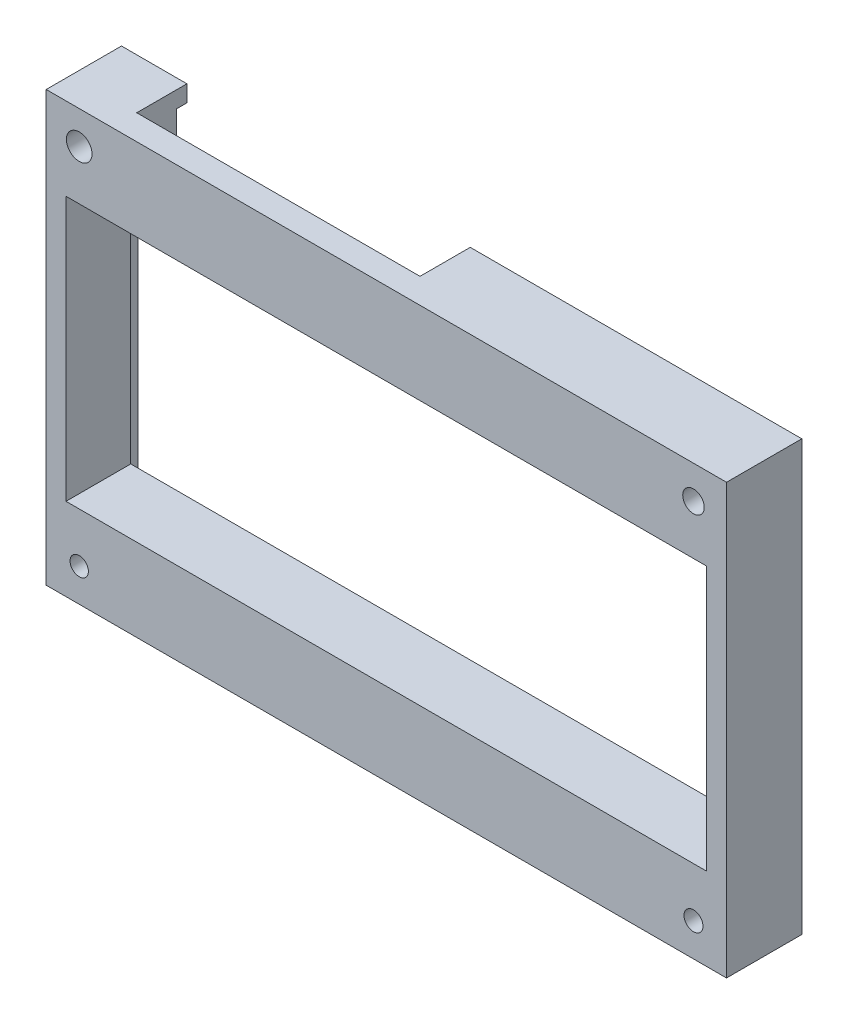
ISO-10303-21;
HEADER;
FILE_DESCRIPTION(('STEP AP214'),'2;1');
FILE_NAME('part.step','',(''),(''),'','','');
FILE_SCHEMA(('AUTOMOTIVE_DESIGN { 1 0 10303 214 1 1 1 1 }'));
ENDSEC;
DATA;
#1=APPLICATION_CONTEXT('core data for automotive mechanical design processes');
#2=APPLICATION_PROTOCOL_DEFINITION('international standard','automotive_design',2000,#1);
#3=PRODUCT_CONTEXT('',#1,'mechanical');
#4=PRODUCT('Part','Part','',(#3));
#5=PRODUCT_RELATED_PRODUCT_CATEGORY('part','',(#4));
#6=PRODUCT_DEFINITION_FORMATION('','',#4);
#7=PRODUCT_DEFINITION_CONTEXT('part definition',#1,'design');
#8=PRODUCT_DEFINITION('design','',#6,#7);
#9=PRODUCT_DEFINITION_SHAPE('','',#8);
#10=(LENGTH_UNIT() NAMED_UNIT(*) SI_UNIT(.MILLI.,.METRE.));
#11=(NAMED_UNIT(*) PLANE_ANGLE_UNIT() SI_UNIT($,.RADIAN.));
#12=(NAMED_UNIT(*) SI_UNIT($,.STERADIAN.) SOLID_ANGLE_UNIT());
#13=UNCERTAINTY_MEASURE_WITH_UNIT(LENGTH_MEASURE(1.E-05),#10,'distance_accuracy_value','');
#14=(GEOMETRIC_REPRESENTATION_CONTEXT(3) GLOBAL_UNCERTAINTY_ASSIGNED_CONTEXT((#13)) GLOBAL_UNIT_ASSIGNED_CONTEXT((#10,
#11,#12)) REPRESENTATION_CONTEXT('',''));
#15=CARTESIAN_POINT('',(0.,0.,0.));
#16=DIRECTION('',(0.,0.,1.));
#17=DIRECTION('',(1.,0.,0.));
#18=AXIS2_PLACEMENT_3D('',#15,#16,#17);
#19=CARTESIAN_POINT('',(-49.,30.0000000000002,-1.6));
#20=DIRECTION('',(0.,-1.,0.));
#21=DIRECTION('',(0.,0.,-1.));
#22=AXIS2_PLACEMENT_3D('',#19,#20,#21);
#23=PLANE('',#22);
#24=DIRECTION('',(0.,0.,1.));
#25=VECTOR('',#24,1.);
#26=CARTESIAN_POINT('',(1.29689939311386,30.0000000000002,-1.6));
#27=LINE('',#26,#25);
#28=CARTESIAN_POINT('',(1.29689939311386,30.0000000000002,-1.6));
#29=VERTEX_POINT('',#28);
#30=CARTESIAN_POINT('',(1.29689939311386,30.0000000000002,0.));
#31=VERTEX_POINT('',#30);
#32=EDGE_CURVE('E11',#29,#31,#27,.T.);
#33=ORIENTED_EDGE('',*,*,#32,.F.);
#34=DIRECTION('',(1.,0.,0.));
#35=VECTOR('',#34,1.);
#36=CARTESIAN_POINT('',(-49.,30.0000000000002,-1.6));
#37=LINE('',#36,#35);
#38=CARTESIAN_POINT('',(49.0000000000001,30.0000000000002,-1.6));
#39=VERTEX_POINT('',#38);
#40=EDGE_CURVE('E281',#29,#39,#37,.T.);
#41=ORIENTED_EDGE('',*,*,#40,.T.);
#42=DIRECTION('',(0.,0.,1.));
#43=VECTOR('',#42,1.);
#44=CARTESIAN_POINT('',(49.0000000000001,30.0000000000002,-1.6));
#45=LINE('',#44,#43);
#46=CARTESIAN_POINT('',(49.0000000000001,30.0000000000002,0.));
#47=VERTEX_POINT('',#46);
#48=EDGE_CURVE('E173',#39,#47,#45,.T.);
#49=ORIENTED_EDGE('',*,*,#48,.T.);
#50=DIRECTION('',(1.,0.,0.));
#51=VECTOR('',#50,1.);
#52=CARTESIAN_POINT('',(-49.,30.0000000000002,0.));
#53=LINE('',#52,#51);
#54=EDGE_CURVE('E171',#31,#47,#53,.T.);
#55=ORIENTED_EDGE('',*,*,#54,.F.);
#56=EDGE_LOOP('',(#33,#41,#49,#55));
#57=FACE_BOUND('',#56,.T.);
#58=ADVANCED_FACE('F39',(#57),#23,.T.);
#59=CARTESIAN_POINT('',(0.,0.,0.));
#60=DIRECTION('',(0.,0.,-1.));
#61=DIRECTION('',(-1.,0.,0.));
#62=AXIS2_PLACEMENT_3D('',#59,#60,#61);
#63=PLANE('',#62);
#64=CARTESIAN_POINT('',(-46.5,-27.5,0.));
#65=DIRECTION('',(0.,0.,-1.));
#66=DIRECTION('',(-1.,0.,0.));
#67=AXIS2_PLACEMENT_3D('',#64,#65,#66);
#68=CIRCLE('',#67,1.38839076776673);
#69=CARTESIAN_POINT('',(-47.8883907677667,-27.5,0.));
#70=VERTEX_POINT('',#69);
#71=EDGE_CURVE('E271',#70,#70,#68,.T.);
#72=ORIENTED_EDGE('',*,*,#71,.F.);
#73=EDGE_LOOP('',(#72));
#74=FACE_BOUND('',#73,.T.);
#75=CARTESIAN_POINT('',(46.5,-27.5,0.));
#76=DIRECTION('',(0.,0.,-1.));
#77=DIRECTION('',(-1.,0.,0.));
#78=AXIS2_PLACEMENT_3D('',#75,#76,#77);
#79=CIRCLE('',#78,1.43808952105127);
#80=CARTESIAN_POINT('',(45.0619104789487,-27.5,0.));
#81=VERTEX_POINT('',#80);
#82=EDGE_CURVE('E260',#81,#81,#79,.T.);
#83=ORIENTED_EDGE('',*,*,#82,.F.);
#84=EDGE_LOOP('',(#83));
#85=FACE_BOUND('',#84,.T.);
#86=CARTESIAN_POINT('',(46.5,27.5,0.));
#87=DIRECTION('',(0.,0.,-1.));
#88=DIRECTION('',(-1.,0.,0.));
#89=AXIS2_PLACEMENT_3D('',#86,#87,#88);
#90=CIRCLE('',#89,1.6299701351415);
#91=CARTESIAN_POINT('',(44.8700298648585,27.5,0.));
#92=VERTEX_POINT('',#91);
#93=EDGE_CURVE('E257',#92,#92,#90,.T.);
#94=ORIENTED_EDGE('',*,*,#93,.F.);
#95=EDGE_LOOP('',(#94));
#96=FACE_BOUND('',#95,.T.);
#97=CARTESIAN_POINT('',(-46.5,27.5,0.));
#98=DIRECTION('',(0.,0.,-1.));
#99=DIRECTION('',(-1.,0.,0.));
#100=AXIS2_PLACEMENT_3D('',#97,#98,#99);
#101=CIRCLE('',#100,1.93858012139443);
#102=CARTESIAN_POINT('',(-48.4385801213944,27.5,0.));
#103=VERTEX_POINT('',#102);
#104=EDGE_CURVE('E254',#103,#103,#101,.T.);
#105=ORIENTED_EDGE('',*,*,#104,.F.);
#106=EDGE_LOOP('',(#105));
#107=FACE_BOUND('',#106,.T.);
#108=DIRECTION('',(0.,1.,0.));
#109=VECTOR('',#108,1.);
#110=CARTESIAN_POINT('',(-48.5,0.,0.));
#111=LINE('',#110,#109);
#112=CARTESIAN_POINT('',(-48.5,-20.,0.));
#113=VERTEX_POINT('',#112);
#114=CARTESIAN_POINT('',(-48.5,20.,0.));
#115=VERTEX_POINT('',#114);
#116=EDGE_CURVE('E177',#113,#115,#111,.T.);
#117=ORIENTED_EDGE('',*,*,#116,.F.);
#118=DIRECTION('',(-1.,0.,0.));
#119=VECTOR('',#118,1.);
#120=CARTESIAN_POINT('',(0.,-20.,0.));
#121=LINE('',#120,#119);
#122=CARTESIAN_POINT('',(48.5,-20.,0.));
#123=VERTEX_POINT('',#122);
#124=EDGE_CURVE('E242',#123,#113,#121,.T.);
#125=ORIENTED_EDGE('',*,*,#124,.F.);
#126=DIRECTION('',(0.,-1.,0.));
#127=VECTOR('',#126,1.);
#128=CARTESIAN_POINT('',(48.5,0.,0.));
#129=LINE('',#128,#127);
#130=CARTESIAN_POINT('',(48.5,20.,0.));
#131=VERTEX_POINT('',#130);
#132=EDGE_CURVE('E244',#131,#123,#129,.T.);
#133=ORIENTED_EDGE('',*,*,#132,.F.);
#134=DIRECTION('',(1.,0.,0.));
#135=VECTOR('',#134,1.);
#136=CARTESIAN_POINT('',(0.,20.,0.));
#137=LINE('',#136,#135);
#138=EDGE_CURVE('E247',#115,#131,#137,.T.);
#139=ORIENTED_EDGE('',*,*,#138,.F.);
#140=EDGE_LOOP('',(#117,#125,#133,#139));
#141=FACE_BOUND('',#140,.T.);
#142=DIRECTION('',(0.,1.,0.));
#143=VECTOR('',#142,1.);
#144=CARTESIAN_POINT('',(-49.,-29.9999999999997,0.));
#145=LINE('',#144,#143);
#146=CARTESIAN_POINT('',(-49.,-29.9999999999997,0.));
#147=VERTEX_POINT('',#146);
#148=CARTESIAN_POINT('',(-49.,30.0000000000002,0.));
#149=VERTEX_POINT('',#148);
#150=EDGE_CURVE('E278',#147,#149,#145,.T.);
#151=ORIENTED_EDGE('',*,*,#150,.T.);
#152=CARTESIAN_POINT('',(-41.5934162505298,30.0000000000002,0.));
#153=VERTEX_POINT('',#152);
#154=EDGE_CURVE('E179',#149,#153,#53,.T.);
#155=ORIENTED_EDGE('',*,*,#154,.T.);
#156=DIRECTION('',(0.,1.,0.));
#157=VECTOR('',#156,1.);
#158=CARTESIAN_POINT('',(-41.5934162505298,32.4999999999999,0.));
#159=LINE('',#158,#157);
#160=CARTESIAN_POINT('',(-41.5934162505298,22.5567983730593,0.));
#161=VERTEX_POINT('',#160);
#162=EDGE_CURVE('E186',#161,#153,#159,.T.);
#163=ORIENTED_EDGE('',*,*,#162,.F.);
#164=DIRECTION('',(-1.,0.,0.));
#165=VECTOR('',#164,1.);
#166=CARTESIAN_POINT('',(-41.5934162505298,22.5567983730593,0.));
#167=LINE('',#166,#165);
#168=CARTESIAN_POINT('',(1.29689939311384,22.5567983730593,0.));
#169=VERTEX_POINT('',#168);
#170=EDGE_CURVE('E185',#169,#161,#167,.T.);
#171=ORIENTED_EDGE('',*,*,#170,.F.);
#172=DIRECTION('',(0.,-1.,0.));
#173=VECTOR('',#172,1.);
#174=CARTESIAN_POINT('',(1.29689939311384,32.4999999999999,0.));
#175=LINE('',#174,#173);
#176=EDGE_CURVE('E166',#31,#169,#175,.T.);
#177=ORIENTED_EDGE('',*,*,#176,.F.);
#178=ORIENTED_EDGE('',*,*,#54,.T.);
#179=DIRECTION('',(0.,-1.,0.));
#180=VECTOR('',#179,1.);
#181=CARTESIAN_POINT('',(49.0000000000001,-29.9999999999997,0.));
#182=LINE('',#181,#180);
#183=CARTESIAN_POINT('',(49.0000000000001,-29.9999999999997,0.));
#184=VERTEX_POINT('',#183);
#185=EDGE_CURVE('E293',#47,#184,#182,.T.);
#186=ORIENTED_EDGE('',*,*,#185,.T.);
#187=DIRECTION('',(-1.,0.,0.));
#188=VECTOR('',#187,1.);
#189=CARTESIAN_POINT('',(-49.,-29.9999999999997,0.));
#190=LINE('',#189,#188);
#191=EDGE_CURVE('E282',#184,#147,#190,.T.);
#192=ORIENTED_EDGE('',*,*,#191,.T.);
#193=EDGE_LOOP('',(#151,#155,#163,#171,#177,#178,#186,#192));
#194=FACE_BOUND('',#193,.T.);
#195=ADVANCED_FACE('F182',(#74,#85,#96,#107,#141,#194),#63,.T.);
#196=CARTESIAN_POINT('',(-51.5,32.4999999999999,9.8));
#197=DIRECTION('',(1.,0.,0.));
#198=DIRECTION('',(0.,1.,0.));
#199=AXIS2_PLACEMENT_3D('',#196,#197,#198);
#200=PLANE('',#199);
#201=DIRECTION('',(0.,0.,-1.));
#202=VECTOR('',#201,1.);
#203=CARTESIAN_POINT('',(-51.5,32.4999999999999,9.8));
#204=LINE('',#203,#202);
#205=CARTESIAN_POINT('',(-51.5,32.4999999999999,9.8));
#206=VERTEX_POINT('',#205);
#207=CARTESIAN_POINT('',(-51.5,32.4999999999999,-1.6));
#208=VERTEX_POINT('',#207);
#209=EDGE_CURVE('E233',#206,#208,#204,.T.);
#210=ORIENTED_EDGE('',*,*,#209,.T.);
#211=DIRECTION('',(0.,1.,0.));
#212=VECTOR('',#211,1.);
#213=CARTESIAN_POINT('',(-51.5,-32.5000000000001,-1.6));
#214=LINE('',#213,#212);
#215=CARTESIAN_POINT('',(-51.5,-32.5000000000001,-1.6));
#216=VERTEX_POINT('',#215);
#217=EDGE_CURVE('E304',#216,#208,#214,.T.);
#218=ORIENTED_EDGE('',*,*,#217,.F.);
#219=DIRECTION('',(0.,0.,-1.));
#220=VECTOR('',#219,1.);
#221=CARTESIAN_POINT('',(-51.5,-32.5000000000001,9.8));
#222=LINE('',#221,#220);
#223=CARTESIAN_POINT('',(-51.5,-32.5000000000001,9.8));
#224=VERTEX_POINT('',#223);
#225=EDGE_CURVE('E240',#224,#216,#222,.T.);
#226=ORIENTED_EDGE('',*,*,#225,.F.);
#227=DIRECTION('',(0.,-1.,0.));
#228=VECTOR('',#227,1.);
#229=CARTESIAN_POINT('',(-51.5,32.4999999999999,9.8));
#230=LINE('',#229,#228);
#231=EDGE_CURVE('E218',#206,#224,#230,.T.);
#232=ORIENTED_EDGE('',*,*,#231,.F.);
#233=EDGE_LOOP('',(#210,#218,#226,#232));
#234=FACE_BOUND('',#233,.T.);
#235=ADVANCED_FACE('F41',(#234),#200,.F.);
#236=CARTESIAN_POINT('',(51.5,-32.5,9.8));
#237=DIRECTION('',(0.,1.,0.));
#238=DIRECTION('',(-1.,0.,0.));
#239=AXIS2_PLACEMENT_3D('',#236,#237,#238);
#240=PLANE('',#239);
#241=ORIENTED_EDGE('',*,*,#225,.T.);
#242=DIRECTION('',(-1.,0.,0.));
#243=VECTOR('',#242,1.);
#244=CARTESIAN_POINT('',(-51.5,-32.5000000000001,-1.6));
#245=LINE('',#244,#243);
#246=CARTESIAN_POINT('',(51.5,-32.5000000000001,-1.6));
#247=VERTEX_POINT('',#246);
#248=EDGE_CURVE('E191',#247,#216,#245,.T.);
#249=ORIENTED_EDGE('',*,*,#248,.F.);
#250=DIRECTION('',(0.,0.,-1.));
#251=VECTOR('',#250,1.);
#252=CARTESIAN_POINT('',(51.5,-32.5,9.8));
#253=LINE('',#252,#251);
#254=CARTESIAN_POINT('',(51.5,-32.5,9.8));
#255=VERTEX_POINT('',#254);
#256=EDGE_CURVE('E238',#255,#247,#253,.T.);
#257=ORIENTED_EDGE('',*,*,#256,.F.);
#258=DIRECTION('',(1.,0.,0.));
#259=VECTOR('',#258,1.);
#260=CARTESIAN_POINT('',(51.5,-32.5,9.8));
#261=LINE('',#260,#259);
#262=EDGE_CURVE('E227',#224,#255,#261,.T.);
#263=ORIENTED_EDGE('',*,*,#262,.F.);
#264=EDGE_LOOP('',(#241,#249,#257,#263));
#265=FACE_BOUND('',#264,.T.);
#266=ADVANCED_FACE('F375',(#265),#240,.F.);
#267=CARTESIAN_POINT('',(51.5,32.4999999999999,9.8));
#268=DIRECTION('',(-1.,0.,0.));
#269=DIRECTION('',(0.,-1.,0.));
#270=AXIS2_PLACEMENT_3D('',#267,#268,#269);
#271=PLANE('',#270);
#272=ORIENTED_EDGE('',*,*,#256,.T.);
#273=DIRECTION('',(0.,-1.,0.));
#274=VECTOR('',#273,1.);
#275=CARTESIAN_POINT('',(51.5,-32.5000000000001,-1.6));
#276=LINE('',#275,#274);
#277=CARTESIAN_POINT('',(51.5,32.4999999999999,-1.6));
#278=VERTEX_POINT('',#277);
#279=EDGE_CURVE('E311',#278,#247,#276,.T.);
#280=ORIENTED_EDGE('',*,*,#279,.F.);
#281=DIRECTION('',(0.,0.,-1.));
#282=VECTOR('',#281,1.);
#283=CARTESIAN_POINT('',(51.5,32.4999999999999,9.8));
#284=LINE('',#283,#282);
#285=CARTESIAN_POINT('',(51.5,32.4999999999999,9.8));
#286=VERTEX_POINT('',#285);
#287=EDGE_CURVE('E235',#286,#278,#284,.T.);
#288=ORIENTED_EDGE('',*,*,#287,.F.);
#289=DIRECTION('',(0.,1.,0.));
#290=VECTOR('',#289,1.);
#291=CARTESIAN_POINT('',(51.5,32.4999999999999,9.8));
#292=LINE('',#291,#290);
#293=EDGE_CURVE('E229',#255,#286,#292,.T.);
#294=ORIENTED_EDGE('',*,*,#293,.F.);
#295=EDGE_LOOP('',(#272,#280,#288,#294));
#296=FACE_BOUND('',#295,.T.);
#297=ADVANCED_FACE('F384',(#296),#271,.F.);
#298=CARTESIAN_POINT('',(51.5,32.4999999999999,9.8));
#299=DIRECTION('',(0.,-1.,0.));
#300=DIRECTION('',(1.,0.,0.));
#301=AXIS2_PLACEMENT_3D('',#298,#299,#300);
#302=PLANE('',#301);
#303=DIRECTION('',(1.,0.,0.));
#304=VECTOR('',#303,1.);
#305=CARTESIAN_POINT('',(-51.5,32.4999999999999,-1.6));
#306=LINE('',#305,#304);
#307=CARTESIAN_POINT('',(1.29689939311385,32.4999999999999,-1.6));
#308=VERTEX_POINT('',#307);
#309=EDGE_CURVE('E307',#308,#278,#306,.T.);
#310=ORIENTED_EDGE('',*,*,#309,.F.);
#311=DIRECTION('',(0.,0.,-1.));
#312=VECTOR('',#311,1.);
#313=CARTESIAN_POINT('',(1.29689939311384,32.4999999999999,6.));
#314=LINE('',#313,#312);
#315=CARTESIAN_POINT('',(1.29689939311384,32.4999999999999,6.));
#316=VERTEX_POINT('',#315);
#317=EDGE_CURVE('E200',#316,#308,#314,.T.);
#318=ORIENTED_EDGE('',*,*,#317,.F.);
#319=DIRECTION('',(1.,0.,0.));
#320=VECTOR('',#319,1.);
#321=CARTESIAN_POINT('',(-41.5934162505298,32.4999999999999,6.));
#322=LINE('',#321,#320);
#323=CARTESIAN_POINT('',(-41.5934162505298,32.4999999999999,6.));
#324=VERTEX_POINT('',#323);
#325=EDGE_CURVE('E318',#324,#316,#322,.T.);
#326=ORIENTED_EDGE('',*,*,#325,.F.);
#327=DIRECTION('',(0.,0.,-1.));
#328=VECTOR('',#327,1.);
#329=CARTESIAN_POINT('',(-41.5934162505298,32.4999999999999,6.));
#330=LINE('',#329,#328);
#331=CARTESIAN_POINT('',(-41.5934162505298,32.4999999999999,-1.6));
#332=VERTEX_POINT('',#331);
#333=EDGE_CURVE('E202',#324,#332,#330,.T.);
#334=ORIENTED_EDGE('',*,*,#333,.T.);
#335=EDGE_CURVE('E308',#208,#332,#306,.T.);
#336=ORIENTED_EDGE('',*,*,#335,.F.);
#337=ORIENTED_EDGE('',*,*,#209,.F.);
#338=DIRECTION('',(-1.,0.,0.));
#339=VECTOR('',#338,1.);
#340=CARTESIAN_POINT('',(51.5,32.4999999999999,9.8));
#341=LINE('',#340,#339);
#342=EDGE_CURVE('E231',#286,#206,#341,.T.);
#343=ORIENTED_EDGE('',*,*,#342,.F.);
#344=ORIENTED_EDGE('',*,*,#287,.T.);
#345=EDGE_LOOP('',(#310,#318,#326,#334,#336,#337,#343,#344));
#346=FACE_BOUND('',#345,.T.);
#347=ADVANCED_FACE('F337',(#346),#302,.F.);
#348=CARTESIAN_POINT('',(0.,0.,9.8));
#349=DIRECTION('',(0.,0.,-1.));
#350=DIRECTION('',(-1.,0.,0.));
#351=AXIS2_PLACEMENT_3D('',#348,#349,#350);
#352=PLANE('',#351);
#353=CARTESIAN_POINT('',(-46.5,-27.5,9.8));
#354=DIRECTION('',(0.,0.,-1.));
#355=DIRECTION('',(-1.,0.,0.));
#356=AXIS2_PLACEMENT_3D('',#353,#354,#355);
#357=CIRCLE('',#356,1.38839076776673);
#358=CARTESIAN_POINT('',(-47.8883907677667,-27.5,9.8));
#359=VERTEX_POINT('',#358);
#360=EDGE_CURVE('E43',#359,#359,#357,.T.);
#361=ORIENTED_EDGE('',*,*,#360,.T.);
#362=EDGE_LOOP('',(#361));
#363=FACE_BOUND('',#362,.T.);
#364=CARTESIAN_POINT('',(46.5,-27.5,9.8));
#365=DIRECTION('',(0.,0.,-1.));
#366=DIRECTION('',(-1.,0.,0.));
#367=AXIS2_PLACEMENT_3D('',#364,#365,#366);
#368=CIRCLE('',#367,1.43808952105127);
#369=CARTESIAN_POINT('',(45.0619104789487,-27.5,9.8));
#370=VERTEX_POINT('',#369);
#371=EDGE_CURVE('E258',#370,#370,#368,.T.);
#372=ORIENTED_EDGE('',*,*,#371,.T.);
#373=EDGE_LOOP('',(#372));
#374=FACE_BOUND('',#373,.T.);
#375=CARTESIAN_POINT('',(46.5,27.5,9.8));
#376=DIRECTION('',(0.,0.,-1.));
#377=DIRECTION('',(-1.,0.,0.));
#378=AXIS2_PLACEMENT_3D('',#375,#376,#377);
#379=CIRCLE('',#378,1.6299701351415);
#380=CARTESIAN_POINT('',(44.8700298648585,27.5,9.8));
#381=VERTEX_POINT('',#380);
#382=EDGE_CURVE('E255',#381,#381,#379,.T.);
#383=ORIENTED_EDGE('',*,*,#382,.T.);
#384=EDGE_LOOP('',(#383));
#385=FACE_BOUND('',#384,.T.);
#386=CARTESIAN_POINT('',(-46.5,27.5,9.8));
#387=DIRECTION('',(0.,0.,-1.));
#388=DIRECTION('',(-1.,0.,0.));
#389=AXIS2_PLACEMENT_3D('',#386,#387,#388);
#390=CIRCLE('',#389,1.93858012139443);
#391=CARTESIAN_POINT('',(-48.4385801213944,27.5,9.8));
#392=VERTEX_POINT('',#391);
#393=EDGE_CURVE('E251',#392,#392,#390,.T.);
#394=ORIENTED_EDGE('',*,*,#393,.T.);
#395=EDGE_LOOP('',(#394));
#396=FACE_BOUND('',#395,.T.);
#397=DIRECTION('',(1.,0.,0.));
#398=VECTOR('',#397,1.);
#399=CARTESIAN_POINT('',(48.5,-20.,9.8));
#400=LINE('',#399,#398);
#401=CARTESIAN_POINT('',(-48.5,-20.,9.8));
#402=VERTEX_POINT('',#401);
#403=CARTESIAN_POINT('',(48.5,-20.,9.8));
#404=VERTEX_POINT('',#403);
#405=EDGE_CURVE('E206',#402,#404,#400,.T.);
#406=ORIENTED_EDGE('',*,*,#405,.F.);
#407=DIRECTION('',(0.,-1.,0.));
#408=VECTOR('',#407,1.);
#409=CARTESIAN_POINT('',(-48.5,-20.,9.8));
#410=LINE('',#409,#408);
#411=CARTESIAN_POINT('',(-48.5,20.,9.8));
#412=VERTEX_POINT('',#411);
#413=EDGE_CURVE('E197',#412,#402,#410,.T.);
#414=ORIENTED_EDGE('',*,*,#413,.F.);
#415=DIRECTION('',(-1.,0.,0.));
#416=VECTOR('',#415,1.);
#417=CARTESIAN_POINT('',(48.5,20.,9.8));
#418=LINE('',#417,#416);
#419=CARTESIAN_POINT('',(48.5,20.,9.8));
#420=VERTEX_POINT('',#419);
#421=EDGE_CURVE('E212',#420,#412,#418,.T.);
#422=ORIENTED_EDGE('',*,*,#421,.F.);
#423=DIRECTION('',(0.,1.,0.));
#424=VECTOR('',#423,1.);
#425=CARTESIAN_POINT('',(48.5,-20.,9.8));
#426=LINE('',#425,#424);
#427=EDGE_CURVE('E209',#404,#420,#426,.T.);
#428=ORIENTED_EDGE('',*,*,#427,.F.);
#429=EDGE_LOOP('',(#406,#414,#422,#428));
#430=FACE_BOUND('',#429,.T.);
#431=ORIENTED_EDGE('',*,*,#231,.T.);
#432=ORIENTED_EDGE('',*,*,#262,.T.);
#433=ORIENTED_EDGE('',*,*,#293,.T.);
#434=ORIENTED_EDGE('',*,*,#342,.T.);
#435=EDGE_LOOP('',(#431,#432,#433,#434));
#436=FACE_BOUND('',#435,.T.);
#437=ADVANCED_FACE('F381',(#363,#374,#385,#396,#430,#436),#352,.F.);
#438=CARTESIAN_POINT('',(-48.5,-20.,-25.2));
#439=DIRECTION('',(-1.,0.,0.));
#440=DIRECTION('',(0.,0.,1.));
#441=AXIS2_PLACEMENT_3D('',#438,#439,#440);
#442=PLANE('',#441);
#443=ORIENTED_EDGE('',*,*,#116,.T.);
#444=DIRECTION('',(0.,0.,1.));
#445=VECTOR('',#444,1.);
#446=CARTESIAN_POINT('',(-48.5,20.,-25.2));
#447=LINE('',#446,#445);
#448=EDGE_CURVE('E216',#115,#412,#447,.T.);
#449=ORIENTED_EDGE('',*,*,#448,.T.);
#450=ORIENTED_EDGE('',*,*,#413,.T.);
#451=DIRECTION('',(0.,0.,1.));
#452=VECTOR('',#451,1.);
#453=CARTESIAN_POINT('',(-48.5,-20.,-25.2));
#454=LINE('',#453,#452);
#455=EDGE_CURVE('E215',#113,#402,#454,.T.);
#456=ORIENTED_EDGE('',*,*,#455,.F.);
#457=EDGE_LOOP('',(#443,#449,#450,#456));
#458=FACE_BOUND('',#457,.T.);
#459=ADVANCED_FACE('F401',(#458),#442,.F.);
#460=CARTESIAN_POINT('',(48.5,20.,-25.2));
#461=DIRECTION('',(0.,1.,0.));
#462=DIRECTION('',(-1.,0.,0.));
#463=AXIS2_PLACEMENT_3D('',#460,#461,#462);
#464=PLANE('',#463);
#465=ORIENTED_EDGE('',*,*,#138,.T.);
#466=DIRECTION('',(0.,0.,1.));
#467=VECTOR('',#466,1.);
#468=CARTESIAN_POINT('',(48.5,20.,-25.2));
#469=LINE('',#468,#467);
#470=EDGE_CURVE('E219',#131,#420,#469,.T.);
#471=ORIENTED_EDGE('',*,*,#470,.T.);
#472=ORIENTED_EDGE('',*,*,#421,.T.);
#473=ORIENTED_EDGE('',*,*,#448,.F.);
#474=EDGE_LOOP('',(#465,#471,#472,#473));
#475=FACE_BOUND('',#474,.T.);
#476=ADVANCED_FACE('F407',(#475),#464,.F.);
#477=CARTESIAN_POINT('',(48.5,-20.,-25.2));
#478=DIRECTION('',(1.,0.,0.));
#479=DIRECTION('',(0.,0.,-1.));
#480=AXIS2_PLACEMENT_3D('',#477,#478,#479);
#481=PLANE('',#480);
#482=ORIENTED_EDGE('',*,*,#132,.T.);
#483=DIRECTION('',(0.,0.,1.));
#484=VECTOR('',#483,1.);
#485=CARTESIAN_POINT('',(48.5,-20.,-25.2));
#486=LINE('',#485,#484);
#487=EDGE_CURVE('E221',#123,#404,#486,.T.);
#488=ORIENTED_EDGE('',*,*,#487,.T.);
#489=ORIENTED_EDGE('',*,*,#427,.T.);
#490=ORIENTED_EDGE('',*,*,#470,.F.);
#491=EDGE_LOOP('',(#482,#488,#489,#490));
#492=FACE_BOUND('',#491,.T.);
#493=ADVANCED_FACE('F432',(#492),#481,.F.);
#494=CARTESIAN_POINT('',(48.5,-20.,-25.2));
#495=DIRECTION('',(0.,-1.,0.));
#496=DIRECTION('',(1.,0.,0.));
#497=AXIS2_PLACEMENT_3D('',#494,#495,#496);
#498=PLANE('',#497);
#499=ORIENTED_EDGE('',*,*,#124,.T.);
#500=ORIENTED_EDGE('',*,*,#455,.T.);
#501=ORIENTED_EDGE('',*,*,#405,.T.);
#502=ORIENTED_EDGE('',*,*,#487,.F.);
#503=EDGE_LOOP('',(#499,#500,#501,#502));
#504=FACE_BOUND('',#503,.T.);
#505=ADVANCED_FACE('F421',(#504),#498,.F.);
#506=CARTESIAN_POINT('',(-41.5934162505298,32.4999999999999,6.));
#507=DIRECTION('',(-1.,0.,0.));
#508=DIRECTION('',(0.,0.,1.));
#509=AXIS2_PLACEMENT_3D('',#506,#507,#508);
#510=PLANE('',#509);
#511=ORIENTED_EDGE('',*,*,#162,.T.);
#512=DIRECTION('',(0.,0.,-1.));
#513=VECTOR('',#512,1.);
#514=CARTESIAN_POINT('',(-41.5934162505298,30.0000000000002,-1.6));
#515=LINE('',#514,#513);
#516=CARTESIAN_POINT('',(-41.5934162505298,30.0000000000002,-1.6));
#517=VERTEX_POINT('',#516);
#518=EDGE_CURVE('E48',#153,#517,#515,.T.);
#519=ORIENTED_EDGE('',*,*,#518,.T.);
#520=DIRECTION('',(0.,1.,0.));
#521=VECTOR('',#520,1.);
#522=CARTESIAN_POINT('',(-41.5934162505298,0.,-1.6));
#523=LINE('',#522,#521);
#524=EDGE_CURVE('E274',#517,#332,#523,.T.);
#525=ORIENTED_EDGE('',*,*,#524,.T.);
#526=ORIENTED_EDGE('',*,*,#333,.F.);
#527=DIRECTION('',(0.,1.,0.));
#528=VECTOR('',#527,1.);
#529=CARTESIAN_POINT('',(-41.5934162505298,32.4999999999999,6.));
#530=LINE('',#529,#528);
#531=CARTESIAN_POINT('',(-41.5934162505298,22.5567983730593,6.));
#532=VERTEX_POINT('',#531);
#533=EDGE_CURVE('E188',#532,#324,#530,.T.);
#534=ORIENTED_EDGE('',*,*,#533,.F.);
#535=DIRECTION('',(0.,0.,-1.));
#536=VECTOR('',#535,1.);
#537=CARTESIAN_POINT('',(-41.5934162505298,22.5567983730593,6.));
#538=LINE('',#537,#536);
#539=EDGE_CURVE('E195',#532,#161,#538,.T.);
#540=ORIENTED_EDGE('',*,*,#539,.T.);
#541=EDGE_LOOP('',(#511,#519,#525,#526,#534,#540));
#542=FACE_BOUND('',#541,.T.);
#543=ADVANCED_FACE('F332',(#542),#510,.F.);
#544=CARTESIAN_POINT('',(-41.5934162505298,22.5567983730593,6.));
#545=DIRECTION('',(0.,-1.,0.));
#546=DIRECTION('',(0.,0.,-1.));
#547=AXIS2_PLACEMENT_3D('',#544,#545,#546);
#548=PLANE('',#547);
#549=ORIENTED_EDGE('',*,*,#170,.T.);
#550=ORIENTED_EDGE('',*,*,#539,.F.);
#551=DIRECTION('',(-1.,0.,0.));
#552=VECTOR('',#551,1.);
#553=CARTESIAN_POINT('',(-41.5934162505298,22.5567983730593,6.));
#554=LINE('',#553,#552);
#555=CARTESIAN_POINT('',(1.29689939311384,22.5567983730593,6.));
#556=VERTEX_POINT('',#555);
#557=EDGE_CURVE('E204',#556,#532,#554,.T.);
#558=ORIENTED_EDGE('',*,*,#557,.F.);
#559=DIRECTION('',(0.,0.,-1.));
#560=VECTOR('',#559,1.);
#561=CARTESIAN_POINT('',(1.29689939311384,22.5567983730593,6.));
#562=LINE('',#561,#560);
#563=EDGE_CURVE('E198',#556,#169,#562,.T.);
#564=ORIENTED_EDGE('',*,*,#563,.T.);
#565=EDGE_LOOP('',(#549,#550,#558,#564));
#566=FACE_BOUND('',#565,.T.);
#567=ADVANCED_FACE('F330',(#566),#548,.F.);
#568=CARTESIAN_POINT('',(1.29689939311384,32.4999999999999,6.));
#569=DIRECTION('',(1.,0.,0.));
#570=DIRECTION('',(0.,0.,-1.));
#571=AXIS2_PLACEMENT_3D('',#568,#569,#570);
#572=PLANE('',#571);
#573=ORIENTED_EDGE('',*,*,#317,.T.);
#574=DIRECTION('',(0.,-1.,0.));
#575=VECTOR('',#574,1.);
#576=CARTESIAN_POINT('',(1.29689939311386,0.,-1.6));
#577=LINE('',#576,#575);
#578=EDGE_CURVE('E55',#308,#29,#577,.T.);
#579=ORIENTED_EDGE('',*,*,#578,.T.);
#580=ORIENTED_EDGE('',*,*,#32,.T.);
#581=ORIENTED_EDGE('',*,*,#176,.T.);
#582=ORIENTED_EDGE('',*,*,#563,.F.);
#583=DIRECTION('',(0.,-1.,0.));
#584=VECTOR('',#583,1.);
#585=CARTESIAN_POINT('',(1.29689939311384,32.4999999999999,6.));
#586=LINE('',#585,#584);
#587=EDGE_CURVE('E321',#316,#556,#586,.T.);
#588=ORIENTED_EDGE('',*,*,#587,.F.);
#589=EDGE_LOOP('',(#573,#579,#580,#581,#582,#588));
#590=FACE_BOUND('',#589,.T.);
#591=ADVANCED_FACE('F164',(#590),#572,.F.);
#592=CARTESIAN_POINT('',(0.,0.,6.));
#593=DIRECTION('',(0.,0.,1.));
#594=DIRECTION('',(1.,0.,0.));
#595=AXIS2_PLACEMENT_3D('',#592,#593,#594);
#596=PLANE('',#595);
#597=ORIENTED_EDGE('',*,*,#533,.T.);
#598=ORIENTED_EDGE('',*,*,#325,.T.);
#599=ORIENTED_EDGE('',*,*,#587,.T.);
#600=ORIENTED_EDGE('',*,*,#557,.T.);
#601=EDGE_LOOP('',(#597,#598,#599,#600));
#602=FACE_BOUND('',#601,.T.);
#603=ADVANCED_FACE('F326',(#602),#596,.F.);
#604=CARTESIAN_POINT('',(0.,0.,-1.6));
#605=DIRECTION('',(0.,0.,-1.));
#606=DIRECTION('',(-1.,0.,0.));
#607=AXIS2_PLACEMENT_3D('',#604,#605,#606);
#608=PLANE('',#607);
#609=ORIENTED_EDGE('',*,*,#578,.F.);
#610=ORIENTED_EDGE('',*,*,#309,.T.);
#611=ORIENTED_EDGE('',*,*,#279,.T.);
#612=ORIENTED_EDGE('',*,*,#248,.T.);
#613=ORIENTED_EDGE('',*,*,#217,.T.);
#614=ORIENTED_EDGE('',*,*,#335,.T.);
#615=ORIENTED_EDGE('',*,*,#524,.F.);
#616=CARTESIAN_POINT('',(-49.,30.0000000000002,-1.6));
#617=VERTEX_POINT('',#616);
#618=EDGE_CURVE('E283',#617,#517,#37,.T.);
#619=ORIENTED_EDGE('',*,*,#618,.F.);
#620=DIRECTION('',(0.,1.,0.));
#621=VECTOR('',#620,1.);
#622=CARTESIAN_POINT('',(-49.,-29.9999999999997,-1.6));
#623=LINE('',#622,#621);
#624=CARTESIAN_POINT('',(-49.,-29.9999999999997,-1.6));
#625=VERTEX_POINT('',#624);
#626=EDGE_CURVE('E279',#625,#617,#623,.T.);
#627=ORIENTED_EDGE('',*,*,#626,.F.);
#628=DIRECTION('',(-1.,0.,0.));
#629=VECTOR('',#628,1.);
#630=CARTESIAN_POINT('',(-49.,-29.9999999999997,-1.6));
#631=LINE('',#630,#629);
#632=CARTESIAN_POINT('',(49.0000000000001,-29.9999999999997,-1.6));
#633=VERTEX_POINT('',#632);
#634=EDGE_CURVE('E289',#633,#625,#631,.T.);
#635=ORIENTED_EDGE('',*,*,#634,.F.);
#636=DIRECTION('',(0.,-1.,0.));
#637=VECTOR('',#636,1.);
#638=CARTESIAN_POINT('',(49.0000000000001,-29.9999999999997,-1.6));
#639=LINE('',#638,#637);
#640=EDGE_CURVE('E286',#39,#633,#639,.T.);
#641=ORIENTED_EDGE('',*,*,#640,.F.);
#642=ORIENTED_EDGE('',*,*,#40,.F.);
#643=EDGE_LOOP('',(#609,#610,#611,#612,#613,#614,#615,#619,#627,#635,#641,#642));
#644=FACE_BOUND('',#643,.T.);
#645=ADVANCED_FACE('F341',(#644),#608,.T.);
#646=CARTESIAN_POINT('',(-49.,-29.9999999999997,-1.6));
#647=DIRECTION('',(1.,0.,0.));
#648=DIRECTION('',(0.,0.,-1.));
#649=AXIS2_PLACEMENT_3D('',#646,#647,#648);
#650=PLANE('',#649);
#651=ORIENTED_EDGE('',*,*,#150,.F.);
#652=DIRECTION('',(0.,0.,1.));
#653=VECTOR('',#652,1.);
#654=CARTESIAN_POINT('',(-49.,-29.9999999999997,-1.6));
#655=LINE('',#654,#653);
#656=EDGE_CURVE('E63',#625,#147,#655,.T.);
#657=ORIENTED_EDGE('',*,*,#656,.F.);
#658=ORIENTED_EDGE('',*,*,#626,.T.);
#659=DIRECTION('',(0.,0.,1.));
#660=VECTOR('',#659,1.);
#661=CARTESIAN_POINT('',(-49.,30.0000000000002,-1.6));
#662=LINE('',#661,#660);
#663=EDGE_CURVE('E301',#617,#149,#662,.T.);
#664=ORIENTED_EDGE('',*,*,#663,.T.);
#665=EDGE_LOOP('',(#651,#657,#658,#664));
#666=FACE_BOUND('',#665,.T.);
#667=ADVANCED_FACE('F349',(#666),#650,.T.);
#668=ORIENTED_EDGE('',*,*,#518,.F.);
#669=ORIENTED_EDGE('',*,*,#154,.F.);
#670=ORIENTED_EDGE('',*,*,#663,.F.);
#671=ORIENTED_EDGE('',*,*,#618,.T.);
#672=EDGE_LOOP('',(#668,#669,#670,#671));
#673=FACE_BOUND('',#672,.T.);
#674=ADVANCED_FACE('F353',(#673),#23,.T.);
#675=CARTESIAN_POINT('',(49.0000000000001,-29.9999999999997,-1.6));
#676=DIRECTION('',(-1.,0.,0.));
#677=DIRECTION('',(0.,0.,1.));
#678=AXIS2_PLACEMENT_3D('',#675,#676,#677);
#679=PLANE('',#678);
#680=ORIENTED_EDGE('',*,*,#185,.F.);
#681=ORIENTED_EDGE('',*,*,#48,.F.);
#682=ORIENTED_EDGE('',*,*,#640,.T.);
#683=DIRECTION('',(0.,0.,1.));
#684=VECTOR('',#683,1.);
#685=CARTESIAN_POINT('',(49.0000000000001,-29.9999999999997,-1.6));
#686=LINE('',#685,#684);
#687=EDGE_CURVE('E298',#633,#184,#686,.T.);
#688=ORIENTED_EDGE('',*,*,#687,.T.);
#689=EDGE_LOOP('',(#680,#681,#682,#688));
#690=FACE_BOUND('',#689,.T.);
#691=ADVANCED_FACE('F345',(#690),#679,.T.);
#692=CARTESIAN_POINT('',(-49.,-29.9999999999997,-1.6));
#693=DIRECTION('',(0.,1.,0.));
#694=DIRECTION('',(0.,0.,1.));
#695=AXIS2_PLACEMENT_3D('',#692,#693,#694);
#696=PLANE('',#695);
#697=ORIENTED_EDGE('',*,*,#191,.F.);
#698=ORIENTED_EDGE('',*,*,#687,.F.);
#699=ORIENTED_EDGE('',*,*,#634,.T.);
#700=ORIENTED_EDGE('',*,*,#656,.T.);
#701=EDGE_LOOP('',(#697,#698,#699,#700));
#702=FACE_BOUND('',#701,.T.);
#703=ADVANCED_FACE('F346',(#702),#696,.T.);
#704=CARTESIAN_POINT('',(-46.5,27.5,31.4));
#705=DIRECTION('',(0.,0.,-1.));
#706=DIRECTION('',(-1.,0.,0.));
#707=AXIS2_PLACEMENT_3D('',#704,#705,#706);
#708=CYLINDRICAL_SURFACE('',#707,1.93858012139443);
#709=ORIENTED_EDGE('',*,*,#104,.T.);
#710=EDGE_LOOP('',(#709));
#711=FACE_BOUND('',#710,.T.);
#712=ORIENTED_EDGE('',*,*,#393,.F.);
#713=EDGE_LOOP('',(#712));
#714=FACE_BOUND('',#713,.T.);
#715=ADVANCED_FACE('F569',(#711,#714),#708,.F.);
#716=CARTESIAN_POINT('',(46.5,27.5,31.4));
#717=DIRECTION('',(0.,0.,-1.));
#718=DIRECTION('',(-1.,0.,0.));
#719=AXIS2_PLACEMENT_3D('',#716,#717,#718);
#720=CYLINDRICAL_SURFACE('',#719,1.6299701351415);
#721=ORIENTED_EDGE('',*,*,#93,.T.);
#722=EDGE_LOOP('',(#721));
#723=FACE_BOUND('',#722,.T.);
#724=ORIENTED_EDGE('',*,*,#382,.F.);
#725=EDGE_LOOP('',(#724));
#726=FACE_BOUND('',#725,.T.);
#727=ADVANCED_FACE('F579',(#723,#726),#720,.F.);
#728=CARTESIAN_POINT('',(46.5,-27.5,31.4));
#729=DIRECTION('',(0.,0.,-1.));
#730=DIRECTION('',(-1.,0.,0.));
#731=AXIS2_PLACEMENT_3D('',#728,#729,#730);
#732=CYLINDRICAL_SURFACE('',#731,1.43808952105127);
#733=ORIENTED_EDGE('',*,*,#82,.T.);
#734=EDGE_LOOP('',(#733));
#735=FACE_BOUND('',#734,.T.);
#736=ORIENTED_EDGE('',*,*,#371,.F.);
#737=EDGE_LOOP('',(#736));
#738=FACE_BOUND('',#737,.T.);
#739=ADVANCED_FACE('F588',(#735,#738),#732,.F.);
#740=CARTESIAN_POINT('',(-46.5,-27.5,31.4));
#741=DIRECTION('',(0.,0.,-1.));
#742=DIRECTION('',(-1.,0.,0.));
#743=AXIS2_PLACEMENT_3D('',#740,#741,#742);
#744=CYLINDRICAL_SURFACE('',#743,1.38839076776673);
#745=ORIENTED_EDGE('',*,*,#71,.T.);
#746=EDGE_LOOP('',(#745));
#747=FACE_BOUND('',#746,.T.);
#748=ORIENTED_EDGE('',*,*,#360,.F.);
#749=EDGE_LOOP('',(#748));
#750=FACE_BOUND('',#749,.T.);
#751=ADVANCED_FACE('F596',(#747,#750),#744,.F.);
#752=CLOSED_SHELL('',(#58,#195,#235,#266,#297,#347,#437,#459,#476,#493,#505,#543,#567,#591,#603,
#645,#667,#674,#691,#703,#715,#727,#739,#751));
#753=MANIFOLD_SOLID_BREP('B2',#752);
#754=ADVANCED_BREP_SHAPE_REPRESENTATION('',(#18,#753),#14);
#755=SHAPE_DEFINITION_REPRESENTATION(#9,#754);
ENDSEC;
END-ISO-10303-21;
